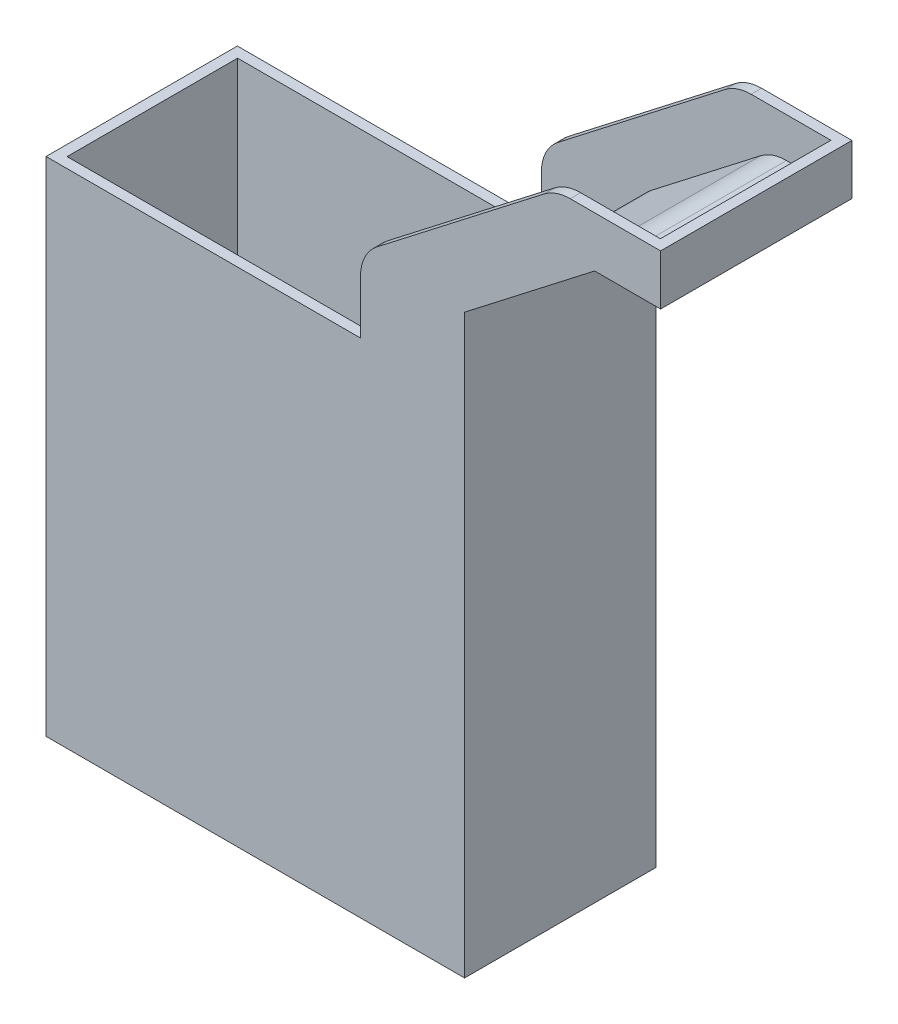
ISO-10303-21;
HEADER;
FILE_DESCRIPTION(('STEP AP214'),'2;1');
FILE_NAME('part.step','',(''),(''),'','','');
FILE_SCHEMA(('AUTOMOTIVE_DESIGN { 1 0 10303 214 1 1 1 1 }'));
ENDSEC;
DATA;
#1=APPLICATION_CONTEXT('core data for automotive mechanical design processes');
#2=APPLICATION_PROTOCOL_DEFINITION('international standard','automotive_design',2000,#1);
#3=PRODUCT_CONTEXT('',#1,'mechanical');
#4=PRODUCT('Part','Part','',(#3));
#5=PRODUCT_RELATED_PRODUCT_CATEGORY('part','',(#4));
#6=PRODUCT_DEFINITION_FORMATION('','',#4);
#7=PRODUCT_DEFINITION_CONTEXT('part definition',#1,'design');
#8=PRODUCT_DEFINITION('design','',#6,#7);
#9=PRODUCT_DEFINITION_SHAPE('','',#8);
#10=(LENGTH_UNIT() NAMED_UNIT(*) SI_UNIT(.MILLI.,.METRE.));
#11=(NAMED_UNIT(*) PLANE_ANGLE_UNIT() SI_UNIT($,.RADIAN.));
#12=(NAMED_UNIT(*) SI_UNIT($,.STERADIAN.) SOLID_ANGLE_UNIT());
#13=UNCERTAINTY_MEASURE_WITH_UNIT(LENGTH_MEASURE(1.E-05),#10,'distance_accuracy_value','');
#14=(GEOMETRIC_REPRESENTATION_CONTEXT(3) GLOBAL_UNCERTAINTY_ASSIGNED_CONTEXT((#13)) GLOBAL_UNIT_ASSIGNED_CONTEXT((#10,
#11,#12)) REPRESENTATION_CONTEXT('',''));
#15=CARTESIAN_POINT('',(0.,0.,0.));
#16=DIRECTION('',(0.,0.,1.));
#17=DIRECTION('',(1.,0.,0.));
#18=AXIS2_PLACEMENT_3D('',#15,#16,#17);
#19=CARTESIAN_POINT('',(734.2385703324,269.428634805462,114.3));
#20=DIRECTION('',(0.,-1.,0.));
#21=DIRECTION('',(0.,0.,-1.));
#22=AXIS2_PLACEMENT_3D('',#19,#20,#21);
#23=PLANE('',#22);
#24=DIRECTION('',(-1.,0.,0.));
#25=VECTOR('',#24,1.);
#26=CARTESIAN_POINT('',(734.2385703324,269.428634805462,-114.3));
#27=LINE('',#26,#25);
#28=CARTESIAN_POINT('',(734.2385703324,269.428634805462,-114.3));
#29=VERTEX_POINT('',#28);
#30=CARTESIAN_POINT('',(626.21075993257,269.428634805462,-114.3));
#31=VERTEX_POINT('',#30);
#32=EDGE_CURVE('E313',#29,#31,#27,.T.);
#33=ORIENTED_EDGE('',*,*,#32,.T.);
#34=DIRECTION('',(0.,0.,-1.));
#35=VECTOR('',#34,1.);
#36=CARTESIAN_POINT('',(626.21075993257,269.428634805462,114.3));
#37=LINE('',#36,#35);
#38=CARTESIAN_POINT('',(626.21075993257,269.428634805462,-101.854));
#39=VERTEX_POINT('',#38);
#40=EDGE_CURVE('E379',#31,#39,#37,.F.);
#41=ORIENTED_EDGE('',*,*,#40,.T.);
#42=DIRECTION('',(-1.,0.,0.));
#43=VECTOR('',#42,1.);
#44=CARTESIAN_POINT('',(734.2385703324,269.428634805462,-101.854));
#45=LINE('',#44,#43);
#46=CARTESIAN_POINT('',(721.5385703324,269.428634805462,-101.854));
#47=VERTEX_POINT('',#46);
#48=EDGE_CURVE('E271',#47,#39,#45,.T.);
#49=ORIENTED_EDGE('',*,*,#48,.F.);
#50=DIRECTION('',(0.,0.,1.));
#51=VECTOR('',#50,1.);
#52=CARTESIAN_POINT('',(721.5385703324,269.428634805462,114.3));
#53=LINE('',#52,#51);
#54=CARTESIAN_POINT('',(721.5385703324,269.428634805462,101.854));
#55=VERTEX_POINT('',#54);
#56=EDGE_CURVE('E351',#47,#55,#53,.T.);
#57=ORIENTED_EDGE('',*,*,#56,.T.);
#58=DIRECTION('',(-1.,0.,0.));
#59=VECTOR('',#58,1.);
#60=CARTESIAN_POINT('',(734.2385703324,269.428634805462,101.854));
#61=LINE('',#60,#59);
#62=CARTESIAN_POINT('',(626.21075993257,269.428634805462,101.854));
#63=VERTEX_POINT('',#62);
#64=EDGE_CURVE('E264',#55,#63,#61,.T.);
#65=ORIENTED_EDGE('',*,*,#64,.T.);
#66=DIRECTION('',(0.,0.,-1.));
#67=VECTOR('',#66,1.);
#68=CARTESIAN_POINT('',(626.21075993257,269.428634805462,114.3));
#69=LINE('',#68,#67);
#70=CARTESIAN_POINT('',(626.21075993257,269.428634805462,114.3));
#71=VERTEX_POINT('',#70);
#72=EDGE_CURVE('E377',#63,#71,#69,.F.);
#73=ORIENTED_EDGE('',*,*,#72,.T.);
#74=DIRECTION('',(-1.,0.,0.));
#75=VECTOR('',#74,1.);
#76=CARTESIAN_POINT('',(734.2385703324,269.428634805462,114.3));
#77=LINE('',#76,#75);
#78=CARTESIAN_POINT('',(734.2385703324,269.428634805462,114.3));
#79=VERTEX_POINT('',#78);
#80=EDGE_CURVE('E289',#79,#71,#77,.T.);
#81=ORIENTED_EDGE('',*,*,#80,.F.);
#82=DIRECTION('',(0.,0.,-1.));
#83=VECTOR('',#82,1.);
#84=CARTESIAN_POINT('',(734.2385703324,269.428634805462,114.3));
#85=LINE('',#84,#83);
#86=EDGE_CURVE('E327',#79,#29,#85,.T.);
#87=ORIENTED_EDGE('',*,*,#86,.T.);
#88=EDGE_LOOP('',(#33,#41,#49,#57,#65,#73,#81,#87));
#89=FACE_BOUND('',#88,.T.);
#90=ADVANCED_FACE('F33',(#89),#23,.F.);
#91=CARTESIAN_POINT('',(608.842711428206,269.428634805462,114.3));
#92=DIRECTION('',(0.612219545438812,-0.790687819675183,0.));
#93=DIRECTION('',(0.790687819675183,0.612219545438811,0.));
#94=AXIS2_PLACEMENT_3D('',#91,#92,#93);
#95=PLANE('',#94);
#96=DIRECTION('',(-0.790687819675183,-0.612219545438811,0.));
#97=VECTOR('',#96,1.);
#98=CARTESIAN_POINT('',(608.842711428206,269.428634805462,-114.3));
#99=LINE('',#98,#97);
#100=CARTESIAN_POINT('',(595.110007024278,258.795576044962,-114.3));
#101=VERTEX_POINT('',#100);
#102=CARTESIAN_POINT('',(395.387375810607,104.152877051941,-114.3));
#103=VERTEX_POINT('',#102);
#104=EDGE_CURVE('E316',#101,#103,#99,.T.);
#105=ORIENTED_EDGE('',*,*,#104,.T.);
#106=DIRECTION('',(0.,0.,-1.));
#107=VECTOR('',#106,1.);
#108=CARTESIAN_POINT('',(395.387375810606,104.152877051941,114.3));
#109=LINE('',#108,#107);
#110=CARTESIAN_POINT('',(395.387375810607,104.152877051941,-101.854));
#111=VERTEX_POINT('',#110);
#112=EDGE_CURVE('E41',#103,#111,#109,.F.);
#113=ORIENTED_EDGE('',*,*,#112,.T.);
#114=DIRECTION('',(-0.790687819675183,-0.612219545438811,0.));
#115=VECTOR('',#114,1.);
#116=CARTESIAN_POINT('',(608.842711428206,269.428634805462,-101.854));
#117=LINE('',#116,#115);
#118=CARTESIAN_POINT('',(595.110007024278,258.795576044962,-101.854));
#119=VERTEX_POINT('',#118);
#120=EDGE_CURVE('E269',#119,#111,#117,.T.);
#121=ORIENTED_EDGE('',*,*,#120,.F.);
#122=DIRECTION('',(0.,0.,-1.));
#123=VECTOR('',#122,1.);
#124=CARTESIAN_POINT('',(595.110007024278,258.795576044962,114.3));
#125=LINE('',#124,#123);
#126=EDGE_CURVE('E372',#119,#101,#125,.T.);
#127=ORIENTED_EDGE('',*,*,#126,.T.);
#128=EDGE_LOOP('',(#105,#113,#121,#127));
#129=FACE_BOUND('',#128,.T.);
#130=ADVANCED_FACE('F467',(#129),#95,.F.);
#131=CARTESIAN_POINT('',(375.688128718898,88.9,114.3));
#132=DIRECTION('',(1.,0.,0.));
#133=DIRECTION('',(0.,1.,0.));
#134=AXIS2_PLACEMENT_3D('',#131,#132,#133);
#135=PLANE('',#134);
#136=DIRECTION('',(0.,-1.,0.));
#137=VECTOR('',#136,1.);
#138=CARTESIAN_POINT('',(375.688128718898,88.9,-101.854));
#139=LINE('',#138,#137);
#140=CARTESIAN_POINT('',(375.688128718898,63.9859358124412,-101.854));
#141=VERTEX_POINT('',#140);
#142=CARTESIAN_POINT('',(375.688128718898,0.,-101.854));
#143=VERTEX_POINT('',#142);
#144=EDGE_CURVE('E267',#141,#143,#139,.T.);
#145=ORIENTED_EDGE('',*,*,#144,.F.);
#146=DIRECTION('',(0.,0.,-1.));
#147=VECTOR('',#146,1.);
#148=CARTESIAN_POINT('',(375.688128718898,63.9859358124412,114.3));
#149=LINE('',#148,#147);
#150=CARTESIAN_POINT('',(375.688128718898,63.9859358124412,-114.3));
#151=VERTEX_POINT('',#150);
#152=EDGE_CURVE('E399',#141,#151,#149,.T.);
#153=ORIENTED_EDGE('',*,*,#152,.T.);
#154=DIRECTION('',(0.,-1.,0.));
#155=VECTOR('',#154,1.);
#156=CARTESIAN_POINT('',(375.688128718898,88.9,-114.3));
#157=LINE('',#156,#155);
#158=CARTESIAN_POINT('',(375.688128718898,0.,-114.3));
#159=VERTEX_POINT('',#158);
#160=EDGE_CURVE('E318',#151,#159,#157,.T.);
#161=ORIENTED_EDGE('',*,*,#160,.T.);
#162=DIRECTION('',(0.,0.,-1.));
#163=VECTOR('',#162,1.);
#164=CARTESIAN_POINT('',(375.688128718898,0.,114.3));
#165=LINE('',#164,#163);
#166=EDGE_CURVE('E323',#143,#159,#165,.T.);
#167=ORIENTED_EDGE('',*,*,#166,.F.);
#168=EDGE_LOOP('',(#145,#153,#161,#167));
#169=FACE_BOUND('',#168,.T.);
#170=ADVANCED_FACE('F405',(#169),#135,.F.);
#171=CARTESIAN_POINT('',(0.,0.,114.3));
#172=DIRECTION('',(0.,-1.,0.));
#173=DIRECTION('',(0.,0.,-1.));
#174=AXIS2_PLACEMENT_3D('',#171,#172,#173);
#175=PLANE('',#174);
#176=DIRECTION('',(-1.,0.,0.));
#177=VECTOR('',#176,1.);
#178=CARTESIAN_POINT('',(0.,0.,-101.854));
#179=LINE('',#178,#177);
#180=CARTESIAN_POINT('',(12.7,0.,-101.854));
#181=VERTEX_POINT('',#180);
#182=EDGE_CURVE('E213',#143,#181,#179,.T.);
#183=ORIENTED_EDGE('',*,*,#182,.F.);
#184=ORIENTED_EDGE('',*,*,#166,.T.);
#185=DIRECTION('',(-1.,0.,0.));
#186=VECTOR('',#185,1.);
#187=CARTESIAN_POINT('',(0.,0.,-114.3));
#188=LINE('',#187,#186);
#189=CARTESIAN_POINT('',(0.,0.,-114.3));
#190=VERTEX_POINT('',#189);
#191=EDGE_CURVE('E279',#159,#190,#188,.T.);
#192=ORIENTED_EDGE('',*,*,#191,.T.);
#193=DIRECTION('',(0.,0.,-1.));
#194=VECTOR('',#193,1.);
#195=CARTESIAN_POINT('',(0.,0.,114.3));
#196=LINE('',#195,#194);
#197=CARTESIAN_POINT('',(0.,0.,114.3));
#198=VERTEX_POINT('',#197);
#199=EDGE_CURVE('E299',#198,#190,#196,.T.);
#200=ORIENTED_EDGE('',*,*,#199,.F.);
#201=DIRECTION('',(-1.,0.,0.));
#202=VECTOR('',#201,1.);
#203=CARTESIAN_POINT('',(0.,0.,114.3));
#204=LINE('',#203,#202);
#205=CARTESIAN_POINT('',(375.688128718898,0.,114.3));
#206=VERTEX_POINT('',#205);
#207=EDGE_CURVE('E297',#206,#198,#204,.T.);
#208=ORIENTED_EDGE('',*,*,#207,.F.);
#209=CARTESIAN_POINT('',(375.688128718898,0.,101.854));
#210=VERTEX_POINT('',#209);
#211=EDGE_CURVE('E324',#206,#210,#165,.T.);
#212=ORIENTED_EDGE('',*,*,#211,.T.);
#213=DIRECTION('',(-1.,0.,0.));
#214=VECTOR('',#213,1.);
#215=CARTESIAN_POINT('',(0.,0.,101.854));
#216=LINE('',#215,#214);
#217=CARTESIAN_POINT('',(12.7,0.,101.854));
#218=VERTEX_POINT('',#217);
#219=EDGE_CURVE('E345',#210,#218,#216,.T.);
#220=ORIENTED_EDGE('',*,*,#219,.T.);
#221=DIRECTION('',(0.,0.,-1.));
#222=VECTOR('',#221,1.);
#223=CARTESIAN_POINT('',(12.7,0.,114.3));
#224=LINE('',#223,#222);
#225=EDGE_CURVE('E348',#218,#181,#224,.T.);
#226=ORIENTED_EDGE('',*,*,#225,.T.);
#227=EDGE_LOOP('',(#183,#184,#192,#200,#208,#212,#220,#226));
#228=FACE_BOUND('',#227,.T.);
#229=ADVANCED_FACE('F415',(#228),#175,.F.);
#230=CARTESIAN_POINT('',(0.,0.,114.3));
#231=DIRECTION('',(1.,0.,0.));
#232=DIRECTION('',(0.,1.,0.));
#233=AXIS2_PLACEMENT_3D('',#230,#231,#232);
#234=PLANE('',#233);
#235=DIRECTION('',(0.,-1.,0.));
#236=VECTOR('',#235,1.);
#237=CARTESIAN_POINT('',(0.,0.,-114.3));
#238=LINE('',#237,#236);
#239=CARTESIAN_POINT('',(0.,-600.,-114.3));
#240=VERTEX_POINT('',#239);
#241=EDGE_CURVE('E274',#190,#240,#238,.T.);
#242=ORIENTED_EDGE('',*,*,#241,.T.);
#243=DIRECTION('',(0.,0.,-1.));
#244=VECTOR('',#243,1.);
#245=CARTESIAN_POINT('',(0.,-600.,114.3));
#246=LINE('',#245,#244);
#247=CARTESIAN_POINT('',(0.,-600.,114.3));
#248=VERTEX_POINT('',#247);
#249=EDGE_CURVE('E342',#248,#240,#246,.T.);
#250=ORIENTED_EDGE('',*,*,#249,.F.);
#251=DIRECTION('',(0.,-1.,0.));
#252=VECTOR('',#251,1.);
#253=CARTESIAN_POINT('',(0.,0.,114.3));
#254=LINE('',#253,#252);
#255=EDGE_CURVE('E275',#198,#248,#254,.T.);
#256=ORIENTED_EDGE('',*,*,#255,.F.);
#257=ORIENTED_EDGE('',*,*,#199,.T.);
#258=EDGE_LOOP('',(#242,#250,#256,#257));
#259=FACE_BOUND('',#258,.T.);
#260=ADVANCED_FACE('F419',(#259),#234,.F.);
#261=CARTESIAN_POINT('',(0.,-600.,114.3));
#262=DIRECTION('',(0.,1.,0.));
#263=DIRECTION('',(0.,0.,1.));
#264=AXIS2_PLACEMENT_3D('',#261,#262,#263);
#265=PLANE('',#264);
#266=DIRECTION('',(1.,0.,0.));
#267=VECTOR('',#266,1.);
#268=CARTESIAN_POINT('',(0.,-600.,-114.3));
#269=LINE('',#268,#267);
#270=CARTESIAN_POINT('',(500.,-600.,-114.3));
#271=VERTEX_POINT('',#270);
#272=EDGE_CURVE('E302',#240,#271,#269,.T.);
#273=ORIENTED_EDGE('',*,*,#272,.T.);
#274=DIRECTION('',(0.,0.,-1.));
#275=VECTOR('',#274,1.);
#276=CARTESIAN_POINT('',(500.,-600.,114.3));
#277=LINE('',#276,#275);
#278=CARTESIAN_POINT('',(500.,-600.,114.3));
#279=VERTEX_POINT('',#278);
#280=EDGE_CURVE('E339',#279,#271,#277,.T.);
#281=ORIENTED_EDGE('',*,*,#280,.F.);
#282=DIRECTION('',(1.,0.,0.));
#283=VECTOR('',#282,1.);
#284=CARTESIAN_POINT('',(0.,-600.,114.3));
#285=LINE('',#284,#283);
#286=EDGE_CURVE('E278',#248,#279,#285,.T.);
#287=ORIENTED_EDGE('',*,*,#286,.F.);
#288=ORIENTED_EDGE('',*,*,#249,.T.);
#289=EDGE_LOOP('',(#273,#281,#287,#288));
#290=FACE_BOUND('',#289,.T.);
#291=ADVANCED_FACE('F517',(#290),#265,.F.);
#292=CARTESIAN_POINT('',(500.,0.,114.3));
#293=DIRECTION('',(-1.,0.,0.));
#294=DIRECTION('',(0.,0.,1.));
#295=AXIS2_PLACEMENT_3D('',#292,#293,#294);
#296=PLANE('',#295);
#297=DIRECTION('',(0.,1.,0.));
#298=VECTOR('',#297,1.);
#299=CARTESIAN_POINT('',(500.,0.,-114.3));
#300=LINE('',#299,#298);
#301=CARTESIAN_POINT('',(500.,88.9,-114.3));
#302=VERTEX_POINT('',#301);
#303=EDGE_CURVE('E305',#271,#302,#300,.T.);
#304=ORIENTED_EDGE('',*,*,#303,.T.);
#305=DIRECTION('',(0.,0.,-1.));
#306=VECTOR('',#305,1.);
#307=CARTESIAN_POINT('',(500.,88.9,114.3));
#308=LINE('',#307,#306);
#309=CARTESIAN_POINT('',(500.,88.9,114.3));
#310=VERTEX_POINT('',#309);
#311=EDGE_CURVE('E336',#310,#302,#308,.T.);
#312=ORIENTED_EDGE('',*,*,#311,.F.);
#313=DIRECTION('',(0.,1.,0.));
#314=VECTOR('',#313,1.);
#315=CARTESIAN_POINT('',(500.,0.,114.3));
#316=LINE('',#315,#314);
#317=EDGE_CURVE('E281',#279,#310,#316,.T.);
#318=ORIENTED_EDGE('',*,*,#317,.F.);
#319=ORIENTED_EDGE('',*,*,#280,.T.);
#320=EDGE_LOOP('',(#304,#312,#318,#319));
#321=FACE_BOUND('',#320,.T.);
#322=ADVANCED_FACE('F513',(#321),#296,.F.);
#323=CARTESIAN_POINT('',(500.,88.9,114.3));
#324=DIRECTION('',(-0.612219545438811,0.790687819675184,0.));
#325=DIRECTION('',(-0.790687819675183,-0.612219545438811,0.));
#326=AXIS2_PLACEMENT_3D('',#323,#324,#325);
#327=PLANE('',#326);
#328=DIRECTION('',(0.790687819675183,0.612219545438811,0.));
#329=VECTOR('',#328,1.);
#330=CARTESIAN_POINT('',(500.,88.9,-114.3));
#331=LINE('',#330,#329);
#332=CARTESIAN_POINT('',(655.436388472872,209.252423203642,-114.3));
#333=VERTEX_POINT('',#332);
#334=EDGE_CURVE('E307',#302,#333,#331,.T.);
#335=ORIENTED_EDGE('',*,*,#334,.T.);
#336=DIRECTION('',(0.,0.,-1.));
#337=VECTOR('',#336,1.);
#338=CARTESIAN_POINT('',(655.436388472872,209.252423203642,114.3));
#339=LINE('',#338,#337);
#340=CARTESIAN_POINT('',(655.436388472872,209.252423203642,114.3));
#341=VERTEX_POINT('',#340);
#342=EDGE_CURVE('E333',#341,#333,#339,.T.);
#343=ORIENTED_EDGE('',*,*,#342,.F.);
#344=DIRECTION('',(0.790687819675183,0.612219545438811,0.));
#345=VECTOR('',#344,1.);
#346=CARTESIAN_POINT('',(500.,88.9,114.3));
#347=LINE('',#346,#345);
#348=EDGE_CURVE('E283',#310,#341,#347,.T.);
#349=ORIENTED_EDGE('',*,*,#348,.F.);
#350=ORIENTED_EDGE('',*,*,#311,.T.);
#351=EDGE_LOOP('',(#335,#343,#349,#350));
#352=FACE_BOUND('',#351,.T.);
#353=ADVANCED_FACE('F509',(#352),#327,.F.);
#354=CARTESIAN_POINT('',(655.436388472872,209.252423203642,114.3));
#355=DIRECTION('',(0.,1.,0.));
#356=DIRECTION('',(0.,0.,1.));
#357=AXIS2_PLACEMENT_3D('',#354,#355,#356);
#358=PLANE('',#357);
#359=DIRECTION('',(1.,0.,0.));
#360=VECTOR('',#359,1.);
#361=CARTESIAN_POINT('',(655.436388472872,209.252423203642,-114.3));
#362=LINE('',#361,#360);
#363=CARTESIAN_POINT('',(734.2385703324,209.252423203642,-114.3));
#364=VERTEX_POINT('',#363);
#365=EDGE_CURVE('E309',#333,#364,#362,.T.);
#366=ORIENTED_EDGE('',*,*,#365,.T.);
#367=DIRECTION('',(0.,0.,-1.));
#368=VECTOR('',#367,1.);
#369=CARTESIAN_POINT('',(734.2385703324,209.252423203642,114.3));
#370=LINE('',#369,#368);
#371=CARTESIAN_POINT('',(734.2385703324,209.252423203642,114.3));
#372=VERTEX_POINT('',#371);
#373=EDGE_CURVE('E330',#372,#364,#370,.T.);
#374=ORIENTED_EDGE('',*,*,#373,.F.);
#375=DIRECTION('',(1.,0.,0.));
#376=VECTOR('',#375,1.);
#377=CARTESIAN_POINT('',(655.436388472872,209.252423203642,114.3));
#378=LINE('',#377,#376);
#379=EDGE_CURVE('E285',#341,#372,#378,.T.);
#380=ORIENTED_EDGE('',*,*,#379,.F.);
#381=ORIENTED_EDGE('',*,*,#342,.T.);
#382=EDGE_LOOP('',(#366,#374,#380,#381));
#383=FACE_BOUND('',#382,.T.);
#384=ADVANCED_FACE('F506',(#383),#358,.F.);
#385=CARTESIAN_POINT('',(734.2385703324,209.252423203642,114.3));
#386=DIRECTION('',(-1.,0.,0.));
#387=DIRECTION('',(0.,0.,1.));
#388=AXIS2_PLACEMENT_3D('',#385,#386,#387);
#389=PLANE('',#388);
#390=DIRECTION('',(0.,1.,0.));
#391=VECTOR('',#390,1.);
#392=CARTESIAN_POINT('',(734.2385703324,209.252423203642,-114.3));
#393=LINE('',#392,#391);
#394=EDGE_CURVE('E311',#364,#29,#393,.T.);
#395=ORIENTED_EDGE('',*,*,#394,.T.);
#396=ORIENTED_EDGE('',*,*,#86,.F.);
#397=DIRECTION('',(0.,1.,0.));
#398=VECTOR('',#397,1.);
#399=CARTESIAN_POINT('',(734.2385703324,209.252423203642,114.3));
#400=LINE('',#399,#398);
#401=EDGE_CURVE('E287',#372,#79,#400,.T.);
#402=ORIENTED_EDGE('',*,*,#401,.F.);
#403=ORIENTED_EDGE('',*,*,#373,.T.);
#404=EDGE_LOOP('',(#395,#396,#402,#403));
#405=FACE_BOUND('',#404,.T.);
#406=ADVANCED_FACE('F473',(#405),#389,.F.);
#407=DIRECTION('',(-0.790687819675183,-0.612219545438811,0.));
#408=VECTOR('',#407,1.);
#409=CARTESIAN_POINT('',(608.842711428206,269.428634805462,101.854));
#410=LINE('',#409,#408);
#411=CARTESIAN_POINT('',(595.110007024278,258.795576044962,101.854));
#412=VERTEX_POINT('',#411);
#413=CARTESIAN_POINT('',(395.387375810607,104.152877051941,101.854));
#414=VERTEX_POINT('',#413);
#415=EDGE_CURVE('E261',#412,#414,#410,.T.);
#416=ORIENTED_EDGE('',*,*,#415,.T.);
#417=DIRECTION('',(0.,0.,-1.));
#418=VECTOR('',#417,1.);
#419=CARTESIAN_POINT('',(395.387375810606,104.152877051941,114.3));
#420=LINE('',#419,#418);
#421=CARTESIAN_POINT('',(395.387375810607,104.152877051941,114.3));
#422=VERTEX_POINT('',#421);
#423=EDGE_CURVE('E395',#414,#422,#420,.F.);
#424=ORIENTED_EDGE('',*,*,#423,.T.);
#425=DIRECTION('',(-0.790687819675183,-0.612219545438811,0.));
#426=VECTOR('',#425,1.);
#427=CARTESIAN_POINT('',(608.842711428206,269.428634805462,114.3));
#428=LINE('',#427,#426);
#429=CARTESIAN_POINT('',(595.110007024278,258.795576044962,114.3));
#430=VERTEX_POINT('',#429);
#431=EDGE_CURVE('E292',#430,#422,#428,.T.);
#432=ORIENTED_EDGE('',*,*,#431,.F.);
#433=DIRECTION('',(0.,0.,-1.));
#434=VECTOR('',#433,1.);
#435=CARTESIAN_POINT('',(595.110007024278,258.795576044962,114.3));
#436=LINE('',#435,#434);
#437=EDGE_CURVE('E383',#430,#412,#436,.T.);
#438=ORIENTED_EDGE('',*,*,#437,.T.);
#439=EDGE_LOOP('',(#416,#424,#432,#438));
#440=FACE_BOUND('',#439,.T.);
#441=ADVANCED_FACE('F485',(#440),#95,.F.);
#442=DIRECTION('',(0.,-1.,0.));
#443=VECTOR('',#442,1.);
#444=CARTESIAN_POINT('',(375.688128718898,88.9,114.3));
#445=LINE('',#444,#443);
#446=CARTESIAN_POINT('',(375.688128718898,63.9859358124412,114.3));
#447=VERTEX_POINT('',#446);
#448=EDGE_CURVE('E295',#447,#206,#445,.T.);
#449=ORIENTED_EDGE('',*,*,#448,.F.);
#450=DIRECTION('',(0.,0.,-1.));
#451=VECTOR('',#450,1.);
#452=CARTESIAN_POINT('',(375.688128718898,63.9859358124412,114.3));
#453=LINE('',#452,#451);
#454=CARTESIAN_POINT('',(375.688128718898,63.9859358124412,101.854));
#455=VERTEX_POINT('',#454);
#456=EDGE_CURVE('E390',#447,#455,#453,.T.);
#457=ORIENTED_EDGE('',*,*,#456,.T.);
#458=DIRECTION('',(0.,-1.,0.));
#459=VECTOR('',#458,1.);
#460=CARTESIAN_POINT('',(375.688128718898,88.9,101.854));
#461=LINE('',#460,#459);
#462=EDGE_CURVE('E258',#455,#210,#461,.T.);
#463=ORIENTED_EDGE('',*,*,#462,.T.);
#464=ORIENTED_EDGE('',*,*,#211,.F.);
#465=EDGE_LOOP('',(#449,#457,#463,#464));
#466=FACE_BOUND('',#465,.T.);
#467=ADVANCED_FACE('F428',(#466),#135,.F.);
#468=CARTESIAN_POINT('',(0.,0.,114.3));
#469=DIRECTION('',(0.,0.,1.));
#470=DIRECTION('',(1.,0.,0.));
#471=AXIS2_PLACEMENT_3D('',#468,#469,#470);
#472=PLANE('',#471);
#473=ORIENTED_EDGE('',*,*,#431,.T.);
#474=CARTESIAN_POINT('',(426.488128718898,63.9859358124412,114.3));
#475=DIRECTION('',(0.,0.,1.));
#476=DIRECTION('',(1.,0.,0.));
#477=AXIS2_PLACEMENT_3D('',#474,#475,#476);
#478=CIRCLE('',#477,50.8);
#479=EDGE_CURVE('E397',#422,#447,#478,.T.);
#480=ORIENTED_EDGE('',*,*,#479,.T.);
#481=ORIENTED_EDGE('',*,*,#448,.T.);
#482=ORIENTED_EDGE('',*,*,#207,.T.);
#483=ORIENTED_EDGE('',*,*,#255,.T.);
#484=ORIENTED_EDGE('',*,*,#286,.T.);
#485=ORIENTED_EDGE('',*,*,#317,.T.);
#486=ORIENTED_EDGE('',*,*,#348,.T.);
#487=ORIENTED_EDGE('',*,*,#379,.T.);
#488=ORIENTED_EDGE('',*,*,#401,.T.);
#489=ORIENTED_EDGE('',*,*,#80,.T.);
#490=CARTESIAN_POINT('',(626.21075993257,218.628634805462,114.3));
#491=DIRECTION('',(0.,0.,1.));
#492=DIRECTION('',(1.,0.,0.));
#493=AXIS2_PLACEMENT_3D('',#490,#491,#492);
#494=CIRCLE('',#493,50.8);
#495=EDGE_CURVE('E388',#71,#430,#494,.T.);
#496=ORIENTED_EDGE('',*,*,#495,.T.);
#497=EDGE_LOOP('',(#473,#480,#481,#482,#483,#484,#485,#486,#487,#488,#489,#496));
#498=FACE_BOUND('',#497,.T.);
#499=ADVANCED_FACE('F422',(#498),#472,.T.);
#500=CARTESIAN_POINT('',(0.,0.,-114.3));
#501=DIRECTION('',(0.,0.,1.));
#502=DIRECTION('',(1.,0.,0.));
#503=AXIS2_PLACEMENT_3D('',#500,#501,#502);
#504=PLANE('',#503);
#505=ORIENTED_EDGE('',*,*,#160,.F.);
#506=CARTESIAN_POINT('',(426.488128718898,63.9859358124412,-114.3));
#507=DIRECTION('',(0.,0.,1.));
#508=DIRECTION('',(1.,0.,0.));
#509=AXIS2_PLACEMENT_3D('',#506,#507,#508);
#510=CIRCLE('',#509,50.8);
#511=EDGE_CURVE('E55',#151,#103,#510,.F.);
#512=ORIENTED_EDGE('',*,*,#511,.T.);
#513=ORIENTED_EDGE('',*,*,#104,.F.);
#514=CARTESIAN_POINT('',(626.21075993257,218.628634805462,-114.3));
#515=DIRECTION('',(0.,0.,1.));
#516=DIRECTION('',(1.,0.,0.));
#517=AXIS2_PLACEMENT_3D('',#514,#515,#516);
#518=CIRCLE('',#517,50.8);
#519=EDGE_CURVE('E375',#101,#31,#518,.F.);
#520=ORIENTED_EDGE('',*,*,#519,.T.);
#521=ORIENTED_EDGE('',*,*,#32,.F.);
#522=ORIENTED_EDGE('',*,*,#394,.F.);
#523=ORIENTED_EDGE('',*,*,#365,.F.);
#524=ORIENTED_EDGE('',*,*,#334,.F.);
#525=ORIENTED_EDGE('',*,*,#303,.F.);
#526=ORIENTED_EDGE('',*,*,#272,.F.);
#527=ORIENTED_EDGE('',*,*,#241,.F.);
#528=ORIENTED_EDGE('',*,*,#191,.F.);
#529=EDGE_LOOP('',(#505,#512,#513,#520,#521,#522,#523,#524,#525,#526,#527,#528));
#530=FACE_BOUND('',#529,.T.);
#531=ADVANCED_FACE('F411',(#530),#504,.F.);
#532=CARTESIAN_POINT('',(721.5385703324,346.822359748718,-101.854));
#533=DIRECTION('',(1.,0.,0.));
#534=DIRECTION('',(0.,0.,-1.));
#535=AXIS2_PLACEMENT_3D('',#532,#533,#534);
#536=PLANE('',#535);
#537=DIRECTION('',(0.,1.,0.));
#538=VECTOR('',#537,1.);
#539=CARTESIAN_POINT('',(721.5385703324,221.952423203642,-101.854));
#540=LINE('',#539,#538);
#541=CARTESIAN_POINT('',(721.5385703324,221.952423203642,-101.854));
#542=VERTEX_POINT('',#541);
#543=EDGE_CURVE('E226',#542,#47,#540,.T.);
#544=ORIENTED_EDGE('',*,*,#543,.F.);
#545=DIRECTION('',(0.,0.,1.));
#546=VECTOR('',#545,1.);
#547=CARTESIAN_POINT('',(721.5385703324,221.952423203642,-101.854));
#548=LINE('',#547,#546);
#549=CARTESIAN_POINT('',(721.5385703324,221.952423203642,101.854));
#550=VERTEX_POINT('',#549);
#551=EDGE_CURVE('E255',#542,#550,#548,.T.);
#552=ORIENTED_EDGE('',*,*,#551,.T.);
#553=DIRECTION('',(0.,1.,0.));
#554=VECTOR('',#553,1.);
#555=CARTESIAN_POINT('',(721.5385703324,346.822359748718,101.854));
#556=LINE('',#555,#554);
#557=EDGE_CURVE('E251',#550,#55,#556,.T.);
#558=ORIENTED_EDGE('',*,*,#557,.T.);
#559=ORIENTED_EDGE('',*,*,#56,.F.);
#560=EDGE_LOOP('',(#544,#552,#558,#559));
#561=FACE_BOUND('',#560,.T.);
#562=ADVANCED_FACE('F458',(#561),#536,.F.);
#563=CARTESIAN_POINT('',(12.7,-12.7,-101.854));
#564=DIRECTION('',(-1.,0.,0.));
#565=DIRECTION('',(0.,0.,1.));
#566=AXIS2_PLACEMENT_3D('',#563,#564,#565);
#567=PLANE('',#566);
#568=DIRECTION('',(0.,-1.,0.));
#569=VECTOR('',#568,1.);
#570=CARTESIAN_POINT('',(12.7,-12.7,101.854));
#571=LINE('',#570,#569);
#572=CARTESIAN_POINT('',(12.7000000000001,-587.3,101.854));
#573=VERTEX_POINT('',#572);
#574=EDGE_CURVE('E217',#218,#573,#571,.T.);
#575=ORIENTED_EDGE('',*,*,#574,.T.);
#576=DIRECTION('',(0.,0.,1.));
#577=VECTOR('',#576,1.);
#578=CARTESIAN_POINT('',(12.7000000000001,-587.3,-101.854));
#579=LINE('',#578,#577);
#580=CARTESIAN_POINT('',(12.7000000000001,-587.3,-101.854));
#581=VERTEX_POINT('',#580);
#582=EDGE_CURVE('E220',#581,#573,#579,.T.);
#583=ORIENTED_EDGE('',*,*,#582,.F.);
#584=DIRECTION('',(0.,-1.,0.));
#585=VECTOR('',#584,1.);
#586=CARTESIAN_POINT('',(12.7,-12.7,-101.854));
#587=LINE('',#586,#585);
#588=EDGE_CURVE('E206',#181,#581,#587,.T.);
#589=ORIENTED_EDGE('',*,*,#588,.F.);
#590=ORIENTED_EDGE('',*,*,#225,.F.);
#591=EDGE_LOOP('',(#575,#583,#589,#590));
#592=FACE_BOUND('',#591,.T.);
#593=ADVANCED_FACE('F221',(#592),#567,.F.);
#594=CARTESIAN_POINT('',(0.,0.,-101.854));
#595=DIRECTION('',(0.,0.,1.));
#596=DIRECTION('',(1.,0.,0.));
#597=AXIS2_PLACEMENT_3D('',#594,#595,#596);
#598=PLANE('',#597);
#599=ORIENTED_EDGE('',*,*,#120,.T.);
#600=CARTESIAN_POINT('',(426.488128718898,63.9859358124412,-101.854));
#601=DIRECTION('',(0.,0.,1.));
#602=DIRECTION('',(1.,0.,0.));
#603=AXIS2_PLACEMENT_3D('',#600,#601,#602);
#604=CIRCLE('',#603,50.8);
#605=EDGE_CURVE('E11',#111,#141,#604,.T.);
#606=ORIENTED_EDGE('',*,*,#605,.T.);
#607=ORIENTED_EDGE('',*,*,#144,.T.);
#608=ORIENTED_EDGE('',*,*,#182,.T.);
#609=ORIENTED_EDGE('',*,*,#588,.T.);
#610=DIRECTION('',(1.,0.,0.));
#611=VECTOR('',#610,1.);
#612=CARTESIAN_POINT('',(12.7000000000001,-587.3,-101.854));
#613=LINE('',#612,#611);
#614=CARTESIAN_POINT('',(487.3,-587.3,-101.854));
#615=VERTEX_POINT('',#614);
#616=EDGE_CURVE('E211',#581,#615,#613,.T.);
#617=ORIENTED_EDGE('',*,*,#616,.T.);
#618=DIRECTION('',(0.,1.,0.));
#619=VECTOR('',#618,1.);
#620=CARTESIAN_POINT('',(487.3,-587.3,-101.854));
#621=LINE('',#620,#619);
#622=CARTESIAN_POINT('',(487.3,70.2144518593307,-101.854));
#623=VERTEX_POINT('',#622);
#624=EDGE_CURVE('E230',#615,#623,#621,.T.);
#625=ORIENTED_EDGE('',*,*,#624,.T.);
#626=CARTESIAN_POINT('',(538.1,70.2144518593309,-101.854));
#627=DIRECTION('',(0.,0.,1.));
#628=DIRECTION('',(1.,0.,0.));
#629=AXIS2_PLACEMENT_3D('',#626,#627,#628);
#630=CIRCLE('',#629,50.8);
#631=CARTESIAN_POINT('',(506.999247091708,110.38139309883,-101.854));
#632=VERTEX_POINT('',#631);
#633=EDGE_CURVE('E361',#623,#632,#630,.F.);
#634=ORIENTED_EDGE('',*,*,#633,.T.);
#635=DIRECTION('',(0.790687819675183,0.612219545438811,0.));
#636=VECTOR('',#635,1.);
#637=CARTESIAN_POINT('',(487.3,95.1285160468897,-101.854));
#638=LINE('',#637,#636);
#639=CARTESIAN_POINT('',(637.361671942853,211.319364443141,-101.854));
#640=VERTEX_POINT('',#639);
#641=EDGE_CURVE('E232',#632,#640,#638,.T.);
#642=ORIENTED_EDGE('',*,*,#641,.T.);
#643=CARTESIAN_POINT('',(668.462424851145,171.152423203642,-101.854));
#644=DIRECTION('',(0.,0.,1.));
#645=DIRECTION('',(1.,0.,0.));
#646=AXIS2_PLACEMENT_3D('',#643,#644,#645);
#647=CIRCLE('',#646,50.8);
#648=CARTESIAN_POINT('',(668.462424851145,221.952423203642,-101.854));
#649=VERTEX_POINT('',#648);
#650=EDGE_CURVE('E370',#640,#649,#647,.F.);
#651=ORIENTED_EDGE('',*,*,#650,.T.);
#652=DIRECTION('',(1.,0.,0.));
#653=VECTOR('',#652,1.);
#654=CARTESIAN_POINT('',(651.094376346781,221.952423203642,-101.854));
#655=LINE('',#654,#653);
#656=EDGE_CURVE('E237',#649,#542,#655,.T.);
#657=ORIENTED_EDGE('',*,*,#656,.T.);
#658=ORIENTED_EDGE('',*,*,#543,.T.);
#659=ORIENTED_EDGE('',*,*,#48,.T.);
#660=CARTESIAN_POINT('',(626.21075993257,218.628634805462,-101.854));
#661=DIRECTION('',(0.,0.,1.));
#662=DIRECTION('',(1.,0.,0.));
#663=AXIS2_PLACEMENT_3D('',#660,#661,#662);
#664=CIRCLE('',#663,50.8);
#665=EDGE_CURVE('E381',#39,#119,#664,.T.);
#666=ORIENTED_EDGE('',*,*,#665,.T.);
#667=EDGE_LOOP('',(#599,#606,#607,#608,#609,#617,#625,#634,#642,#651,#657,#658,#659,#666));
#668=FACE_BOUND('',#667,.T.);
#669=ADVANCED_FACE('F208',(#668),#598,.T.);
#670=CARTESIAN_POINT('',(0.,0.,101.854));
#671=DIRECTION('',(0.,0.,1.));
#672=DIRECTION('',(1.,0.,0.));
#673=AXIS2_PLACEMENT_3D('',#670,#671,#672);
#674=PLANE('',#673);
#675=ORIENTED_EDGE('',*,*,#462,.F.);
#676=CARTESIAN_POINT('',(426.488128718898,63.9859358124412,101.854));
#677=DIRECTION('',(0.,0.,1.));
#678=DIRECTION('',(1.,0.,0.));
#679=AXIS2_PLACEMENT_3D('',#676,#677,#678);
#680=CIRCLE('',#679,50.8);
#681=EDGE_CURVE('E393',#455,#414,#680,.F.);
#682=ORIENTED_EDGE('',*,*,#681,.T.);
#683=ORIENTED_EDGE('',*,*,#415,.F.);
#684=CARTESIAN_POINT('',(626.21075993257,218.628634805462,101.854));
#685=DIRECTION('',(0.,0.,1.));
#686=DIRECTION('',(1.,0.,0.));
#687=AXIS2_PLACEMENT_3D('',#684,#685,#686);
#688=CIRCLE('',#687,50.8);
#689=EDGE_CURVE('E386',#412,#63,#688,.F.);
#690=ORIENTED_EDGE('',*,*,#689,.T.);
#691=ORIENTED_EDGE('',*,*,#64,.F.);
#692=ORIENTED_EDGE('',*,*,#557,.F.);
#693=DIRECTION('',(1.,0.,0.));
#694=VECTOR('',#693,1.);
#695=CARTESIAN_POINT('',(651.094376346781,221.952423203642,101.854));
#696=LINE('',#695,#694);
#697=CARTESIAN_POINT('',(668.462424851145,221.952423203642,101.854));
#698=VERTEX_POINT('',#697);
#699=EDGE_CURVE('E249',#698,#550,#696,.T.);
#700=ORIENTED_EDGE('',*,*,#699,.F.);
#701=CARTESIAN_POINT('',(668.462424851145,171.152423203642,101.854));
#702=DIRECTION('',(0.,0.,1.));
#703=DIRECTION('',(1.,0.,0.));
#704=AXIS2_PLACEMENT_3D('',#701,#702,#703);
#705=CIRCLE('',#704,50.8);
#706=CARTESIAN_POINT('',(637.361671942853,211.319364443141,101.854));
#707=VERTEX_POINT('',#706);
#708=EDGE_CURVE('E368',#698,#707,#705,.T.);
#709=ORIENTED_EDGE('',*,*,#708,.T.);
#710=DIRECTION('',(0.790687819675183,0.612219545438811,0.));
#711=VECTOR('',#710,1.);
#712=CARTESIAN_POINT('',(487.3,95.1285160468897,101.854));
#713=LINE('',#712,#711);
#714=CARTESIAN_POINT('',(506.999247091708,110.38139309883,101.854));
#715=VERTEX_POINT('',#714);
#716=EDGE_CURVE('E246',#715,#707,#713,.T.);
#717=ORIENTED_EDGE('',*,*,#716,.F.);
#718=CARTESIAN_POINT('',(538.1,70.2144518593309,101.854));
#719=DIRECTION('',(0.,0.,1.));
#720=DIRECTION('',(1.,0.,0.));
#721=AXIS2_PLACEMENT_3D('',#718,#719,#720);
#722=CIRCLE('',#721,50.8);
#723=CARTESIAN_POINT('',(487.3,70.2144518593307,101.854));
#724=VERTEX_POINT('',#723);
#725=EDGE_CURVE('E359',#715,#724,#722,.T.);
#726=ORIENTED_EDGE('',*,*,#725,.T.);
#727=DIRECTION('',(0.,1.,0.));
#728=VECTOR('',#727,1.);
#729=CARTESIAN_POINT('',(487.3,-587.3,101.854));
#730=LINE('',#729,#728);
#731=CARTESIAN_POINT('',(487.3,-587.3,101.854));
#732=VERTEX_POINT('',#731);
#733=EDGE_CURVE('E243',#732,#724,#730,.T.);
#734=ORIENTED_EDGE('',*,*,#733,.F.);
#735=DIRECTION('',(1.,0.,0.));
#736=VECTOR('',#735,1.);
#737=CARTESIAN_POINT('',(12.7000000000001,-587.3,101.854));
#738=LINE('',#737,#736);
#739=EDGE_CURVE('E241',#573,#732,#738,.T.);
#740=ORIENTED_EDGE('',*,*,#739,.F.);
#741=ORIENTED_EDGE('',*,*,#574,.F.);
#742=ORIENTED_EDGE('',*,*,#219,.F.);
#743=EDGE_LOOP('',(#675,#682,#683,#690,#691,#692,#700,#709,#717,#726,#734,#740,#741,#742));
#744=FACE_BOUND('',#743,.T.);
#745=ADVANCED_FACE('F432',(#744),#674,.F.);
#746=CARTESIAN_POINT('',(651.094376346781,221.952423203642,-101.854));
#747=DIRECTION('',(0.,-1.,0.));
#748=DIRECTION('',(0.,0.,-1.));
#749=AXIS2_PLACEMENT_3D('',#746,#747,#748);
#750=PLANE('',#749);
#751=ORIENTED_EDGE('',*,*,#656,.F.);
#752=DIRECTION('',(0.,0.,1.));
#753=VECTOR('',#752,1.);
#754=CARTESIAN_POINT('',(668.462424851145,221.952423203642,-101.854));
#755=LINE('',#754,#753);
#756=EDGE_CURVE('E363',#649,#698,#755,.T.);
#757=ORIENTED_EDGE('',*,*,#756,.T.);
#758=ORIENTED_EDGE('',*,*,#699,.T.);
#759=ORIENTED_EDGE('',*,*,#551,.F.);
#760=EDGE_LOOP('',(#751,#757,#758,#759));
#761=FACE_BOUND('',#760,.T.);
#762=ADVANCED_FACE('F453',(#761),#750,.F.);
#763=CARTESIAN_POINT('',(487.3,95.1285160468897,-101.854));
#764=DIRECTION('',(0.612219545438811,-0.790687819675183,0.));
#765=DIRECTION('',(0.790687819675183,0.612219545438812,0.));
#766=AXIS2_PLACEMENT_3D('',#763,#764,#765);
#767=PLANE('',#766);
#768=ORIENTED_EDGE('',*,*,#716,.T.);
#769=DIRECTION('',(0.,0.,1.));
#770=VECTOR('',#769,1.);
#771=CARTESIAN_POINT('',(637.361671942853,211.319364443141,-101.854));
#772=LINE('',#771,#770);
#773=EDGE_CURVE('E366',#707,#640,#772,.F.);
#774=ORIENTED_EDGE('',*,*,#773,.T.);
#775=ORIENTED_EDGE('',*,*,#641,.F.);
#776=DIRECTION('',(0.,0.,1.));
#777=VECTOR('',#776,1.);
#778=CARTESIAN_POINT('',(506.999247091708,110.38139309883,-101.854));
#779=LINE('',#778,#777);
#780=EDGE_CURVE('E354',#632,#715,#779,.T.);
#781=ORIENTED_EDGE('',*,*,#780,.T.);
#782=EDGE_LOOP('',(#768,#774,#775,#781));
#783=FACE_BOUND('',#782,.T.);
#784=ADVANCED_FACE('F445',(#783),#767,.F.);
#785=CARTESIAN_POINT('',(487.3,-587.3,-101.854));
#786=DIRECTION('',(1.,0.,0.));
#787=DIRECTION('',(0.,1.,0.));
#788=AXIS2_PLACEMENT_3D('',#785,#786,#787);
#789=PLANE('',#788);
#790=ORIENTED_EDGE('',*,*,#733,.T.);
#791=DIRECTION('',(0.,0.,1.));
#792=VECTOR('',#791,1.);
#793=CARTESIAN_POINT('',(487.3,70.2144518593309,-101.854));
#794=LINE('',#793,#792);
#795=EDGE_CURVE('E357',#724,#623,#794,.F.);
#796=ORIENTED_EDGE('',*,*,#795,.T.);
#797=ORIENTED_EDGE('',*,*,#624,.F.);
#798=DIRECTION('',(0.,0.,1.));
#799=VECTOR('',#798,1.);
#800=CARTESIAN_POINT('',(487.3,-587.3,-101.854));
#801=LINE('',#800,#799);
#802=EDGE_CURVE('E225',#615,#732,#801,.T.);
#803=ORIENTED_EDGE('',*,*,#802,.T.);
#804=EDGE_LOOP('',(#790,#796,#797,#803));
#805=FACE_BOUND('',#804,.T.);
#806=ADVANCED_FACE('F437',(#805),#789,.F.);
#807=CARTESIAN_POINT('',(12.7000000000001,-587.3,-101.854));
#808=DIRECTION('',(0.,-1.,0.));
#809=DIRECTION('',(0.,0.,-1.));
#810=AXIS2_PLACEMENT_3D('',#807,#808,#809);
#811=PLANE('',#810);
#812=ORIENTED_EDGE('',*,*,#739,.T.);
#813=ORIENTED_EDGE('',*,*,#802,.F.);
#814=ORIENTED_EDGE('',*,*,#616,.F.);
#815=ORIENTED_EDGE('',*,*,#582,.T.);
#816=EDGE_LOOP('',(#812,#813,#814,#815));
#817=FACE_BOUND('',#816,.T.);
#818=ADVANCED_FACE('F228',(#817),#811,.F.);
#819=CARTESIAN_POINT('',(538.1,70.2144518593309,-101.854));
#820=DIRECTION('',(0.,0.,1.));
#821=DIRECTION('',(1.,0.,0.));
#822=AXIS2_PLACEMENT_3D('',#819,#820,#821);
#823=CYLINDRICAL_SURFACE('',#822,50.8);
#824=ORIENTED_EDGE('',*,*,#633,.F.);
#825=ORIENTED_EDGE('',*,*,#795,.F.);
#826=ORIENTED_EDGE('',*,*,#725,.F.);
#827=ORIENTED_EDGE('',*,*,#780,.F.);
#828=EDGE_LOOP('',(#824,#825,#826,#827));
#829=FACE_BOUND('',#828,.T.);
#830=ADVANCED_FACE('F440',(#829),#823,.T.);
#831=CARTESIAN_POINT('',(668.462424851145,171.152423203642,-101.854));
#832=DIRECTION('',(0.,0.,1.));
#833=DIRECTION('',(1.,0.,0.));
#834=AXIS2_PLACEMENT_3D('',#831,#832,#833);
#835=CYLINDRICAL_SURFACE('',#834,50.8);
#836=ORIENTED_EDGE('',*,*,#650,.F.);
#837=ORIENTED_EDGE('',*,*,#773,.F.);
#838=ORIENTED_EDGE('',*,*,#708,.F.);
#839=ORIENTED_EDGE('',*,*,#756,.F.);
#840=EDGE_LOOP('',(#836,#837,#838,#839));
#841=FACE_BOUND('',#840,.T.);
#842=ADVANCED_FACE('F448',(#841),#835,.T.);
#843=CARTESIAN_POINT('',(626.21075993257,218.628634805462,114.3));
#844=DIRECTION('',(0.,0.,-1.));
#845=DIRECTION('',(-1.,0.,0.));
#846=AXIS2_PLACEMENT_3D('',#843,#844,#845);
#847=CYLINDRICAL_SURFACE('',#846,50.8);
#848=ORIENTED_EDGE('',*,*,#665,.F.);
#849=ORIENTED_EDGE('',*,*,#40,.F.);
#850=ORIENTED_EDGE('',*,*,#519,.F.);
#851=ORIENTED_EDGE('',*,*,#126,.F.);
#852=EDGE_LOOP('',(#848,#849,#850,#851));
#853=FACE_BOUND('',#852,.T.);
#854=ADVANCED_FACE('F465',(#853),#847,.T.);
#855=CARTESIAN_POINT('',(626.21075993257,218.628634805462,114.3));
#856=DIRECTION('',(0.,0.,-1.));
#857=DIRECTION('',(-1.,0.,0.));
#858=AXIS2_PLACEMENT_3D('',#855,#856,#857);
#859=CYLINDRICAL_SURFACE('',#858,50.8);
#860=ORIENTED_EDGE('',*,*,#495,.F.);
#861=ORIENTED_EDGE('',*,*,#72,.F.);
#862=ORIENTED_EDGE('',*,*,#689,.F.);
#863=ORIENTED_EDGE('',*,*,#437,.F.);
#864=EDGE_LOOP('',(#860,#861,#862,#863));
#865=FACE_BOUND('',#864,.T.);
#866=ADVANCED_FACE('F482',(#865),#859,.T.);
#867=CARTESIAN_POINT('',(426.488128718898,63.9859358124412,114.3));
#868=DIRECTION('',(0.,0.,-1.));
#869=DIRECTION('',(-1.,0.,0.));
#870=AXIS2_PLACEMENT_3D('',#867,#868,#869);
#871=CYLINDRICAL_SURFACE('',#870,50.8);
#872=ORIENTED_EDGE('',*,*,#479,.F.);
#873=ORIENTED_EDGE('',*,*,#423,.F.);
#874=ORIENTED_EDGE('',*,*,#681,.F.);
#875=ORIENTED_EDGE('',*,*,#456,.F.);
#876=EDGE_LOOP('',(#872,#873,#874,#875));
#877=FACE_BOUND('',#876,.T.);
#878=ADVANCED_FACE('F489',(#877),#871,.T.);
#879=CARTESIAN_POINT('',(426.488128718898,63.9859358124412,114.3));
#880=DIRECTION('',(0.,0.,-1.));
#881=DIRECTION('',(-1.,0.,0.));
#882=AXIS2_PLACEMENT_3D('',#879,#880,#881);
#883=CYLINDRICAL_SURFACE('',#882,50.8);
#884=ORIENTED_EDGE('',*,*,#605,.F.);
#885=ORIENTED_EDGE('',*,*,#112,.F.);
#886=ORIENTED_EDGE('',*,*,#511,.F.);
#887=ORIENTED_EDGE('',*,*,#152,.F.);
#888=EDGE_LOOP('',(#884,#885,#886,#887));
#889=FACE_BOUND('',#888,.T.);
#890=ADVANCED_FACE('F35',(#889),#883,.T.);
#891=CLOSED_SHELL('',(#90,#130,#170,#229,#260,#291,#322,#353,#384,#406,#441,#467,#499,#531,#562,
#593,#669,#745,#762,#784,#806,#818,#830,#842,#854,#866,#878,#890));
#892=MANIFOLD_SOLID_BREP('B2',#891);
#893=ADVANCED_BREP_SHAPE_REPRESENTATION('',(#18,#892),#14);
#894=SHAPE_DEFINITION_REPRESENTATION(#9,#893);
ENDSEC;
END-ISO-10303-21;
